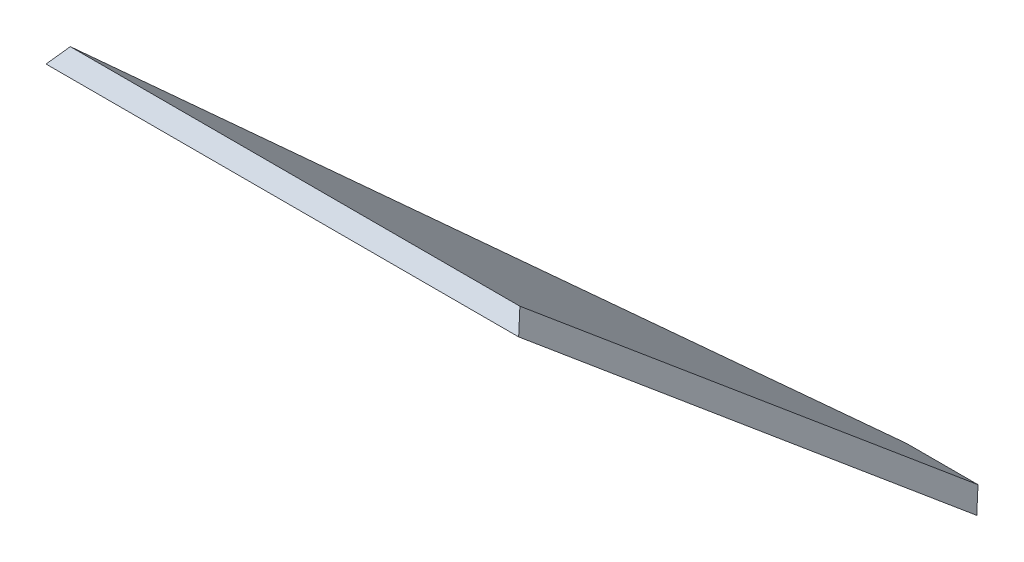
ISO-10303-21;
HEADER;
FILE_DESCRIPTION(('STEP AP214'),'2;1');
FILE_NAME('part.step','',(''),(''),'','','');
FILE_SCHEMA(('AUTOMOTIVE_DESIGN { 1 0 10303 214 1 1 1 1 }'));
ENDSEC;
DATA;
#1=APPLICATION_CONTEXT('core data for automotive mechanical design processes');
#2=APPLICATION_PROTOCOL_DEFINITION('international standard','automotive_design',2000,#1);
#3=PRODUCT_CONTEXT('',#1,'mechanical');
#4=PRODUCT('Part','Part','',(#3));
#5=PRODUCT_RELATED_PRODUCT_CATEGORY('part','',(#4));
#6=PRODUCT_DEFINITION_FORMATION('','',#4);
#7=PRODUCT_DEFINITION_CONTEXT('part definition',#1,'design');
#8=PRODUCT_DEFINITION('design','',#6,#7);
#9=PRODUCT_DEFINITION_SHAPE('','',#8);
#10=(LENGTH_UNIT() NAMED_UNIT(*) SI_UNIT(.MILLI.,.METRE.));
#11=(NAMED_UNIT(*) PLANE_ANGLE_UNIT() SI_UNIT($,.RADIAN.));
#12=(NAMED_UNIT(*) SI_UNIT($,.STERADIAN.) SOLID_ANGLE_UNIT());
#13=UNCERTAINTY_MEASURE_WITH_UNIT(LENGTH_MEASURE(1.E-05),#10,'distance_accuracy_value','');
#14=(GEOMETRIC_REPRESENTATION_CONTEXT(3) GLOBAL_UNCERTAINTY_ASSIGNED_CONTEXT((#13)) GLOBAL_UNIT_ASSIGNED_CONTEXT((#10,
#11,#12)) REPRESENTATION_CONTEXT('',''));
#15=CARTESIAN_POINT('',(0.,0.,0.));
#16=DIRECTION('',(0.,0.,1.));
#17=DIRECTION('',(1.,0.,0.));
#18=AXIS2_PLACEMENT_3D('',#15,#16,#17);
#19=CARTESIAN_POINT('',(159.440890218229,313.348268491755,89.3256315210229));
#20=DIRECTION('',(-0.843459103537497,0.255501074852022,-0.472541999624567));
#21=DIRECTION('',(-0.488764700454788,0.,0.872415650701741));
#22=AXIS2_PLACEMENT_3D('',#19,#20,#21);
#23=PLANE('',#22);
#24=DIRECTION('',(-0.513309975276949,-0.642705823376138,0.568719697108847));
#25=VECTOR('',#24,1.);
#26=CARTESIAN_POINT('',(-10.582845755189,20.5425692053769,234.489229864168));
#27=LINE('',#26,#25);
#28=CARTESIAN_POINT('',(-1.87445158451926,31.4461867373068,224.84079999998));
#29=VERTEX_POINT('',#28);
#30=CARTESIAN_POINT('',(4.77217542707278,39.7683041554508,217.476696664975));
#31=VERTEX_POINT('',#30);
#32=EDGE_CURVE('E82',#29,#31,#27,.F.);
#33=ORIENTED_EDGE('',*,*,#32,.F.);
#34=DIRECTION('',(-0.213764834318811,0.647368565890785,0.731586314459996));
#35=VECTOR('',#34,1.);
#36=CARTESIAN_POINT('',(-12.3211297202073,63.0830603352195,260.59339129963));
#37=LINE('',#36,#35);
#38=CARTESIAN_POINT('',(-110.9083960964,361.646186737307,597.997319736598));
#39=VERTEX_POINT('',#38);
#40=EDGE_CURVE('E41',#29,#39,#37,.T.);
#41=ORIENTED_EDGE('',*,*,#40,.T.);
#42=DIRECTION('',(-0.513309975276949,-0.642705823376138,0.568719697108847));
#43=VECTOR('',#42,1.);
#44=CARTESIAN_POINT('',(-135.699548533921,330.605648257212,625.464576139786));
#45=LINE('',#44,#43);
#46=CARTESIAN_POINT('',(-104.261769084808,369.968304155451,590.633216401593));
#47=VERTEX_POINT('',#46);
#48=EDGE_CURVE('E83',#47,#39,#45,.T.);
#49=ORIENTED_EDGE('',*,*,#48,.F.);
#50=DIRECTION('',(-0.213764834318811,0.647368565890785,0.731586314459996));
#51=VECTOR('',#50,1.);
#52=CARTESIAN_POINT('',(-5.97822301774842,72.3249688012315,254.268736863194));
#53=LINE('',#52,#51);
#54=EDGE_CURVE('E79',#31,#47,#53,.T.);
#55=ORIENTED_EDGE('',*,*,#54,.F.);
#56=EDGE_LOOP('',(#33,#41,#49,#55));
#57=FACE_BOUND('',#56,.T.);
#58=ADVANCED_FACE('F38',(#57),#23,.T.);
#59=CARTESIAN_POINT('',(-123.381202334399,324.271488093634,69.1234463208217));
#60=DIRECTION('',(0.843459103537485,0.255501074852039,-0.472541999624579));
#61=DIRECTION('',(-0.488764700454802,0.,-0.872415650701733));
#62=AXIS2_PLACEMENT_3D('',#59,#60,#61);
#63=PLANE('',#62);
#64=DIRECTION('',(-0.51330997527697,0.642705823376129,-0.568719697108839));
#65=VECTOR('',#64,1.);
#66=CARTESIAN_POINT('',(65.0027706220085,482.587615000697,490.978260708074));
#67=LINE('',#66,#65);
#68=CARTESIAN_POINT('',(161.595082833736,361.646186737307,597.997319736598));
#69=VERTEX_POINT('',#68);
#70=CARTESIAN_POINT('',(154.948455822144,369.968304155451,590.633216401593));
#71=VERTEX_POINT('',#70);
#72=EDGE_CURVE('E97',#69,#71,#67,.T.);
#73=ORIENTED_EDGE('',*,*,#72,.F.);
#74=DIRECTION('',(-0.213764834318812,-0.647368565890785,-0.731586314459996));
#75=VECTOR('',#74,1.);
#76=CARTESIAN_POINT('',(60.6916678098232,56.0688017306996,252.666630762394));
#77=LINE('',#76,#75);
#78=CARTESIAN_POINT('',(52.5611383218553,31.4461867373069,224.84079999998));
#79=VERTEX_POINT('',#78);
#80=EDGE_CURVE('E11',#69,#79,#77,.T.);
#81=ORIENTED_EDGE('',*,*,#80,.T.);
#82=DIRECTION('',(-0.51330997527697,0.642705823376129,-0.568719697108839));
#83=VECTOR('',#82,1.);
#84=CARTESIAN_POINT('',(29.5096667577666,60.3085033202547,199.301015937206));
#85=LINE('',#84,#83);
#86=CARTESIAN_POINT('',(45.9145113102629,39.7683041554508,217.476696664976));
#87=VERTEX_POINT('',#86);
#88=EDGE_CURVE('E88',#87,#79,#85,.F.);
#89=ORIENTED_EDGE('',*,*,#88,.F.);
#90=DIRECTION('',(-0.213764834318812,-0.647368565890785,-0.731586314459996));
#91=VECTOR('',#90,1.);
#92=CARTESIAN_POINT('',(54.3487611073639,65.3107101967116,246.341976325958));
#93=LINE('',#92,#91);
#94=EDGE_CURVE('E89',#71,#87,#93,.T.);
#95=ORIENTED_EDGE('',*,*,#94,.F.);
#96=EDGE_LOOP('',(#73,#81,#89,#95));
#97=FACE_BOUND('',#96,.T.);
#98=ADVANCED_FACE('F119',(#97),#63,.T.);
#99=CARTESIAN_POINT('',(-204.997061337424,361.646186737307,597.997319736598));
#100=DIRECTION('',(0.,0.662686464342369,0.748896955513514));
#101=DIRECTION('',(1.,0.,0.));
#102=AXIS2_PLACEMENT_3D('',#99,#100,#101);
#103=PLANE('',#102);
#104=DIRECTION('',(1.,0.,0.));
#105=VECTOR('',#104,1.);
#106=CARTESIAN_POINT('',(0.,369.968304155451,590.633216401593));
#107=LINE('',#106,#105);
#108=EDGE_CURVE('E101',#47,#71,#107,.T.);
#109=ORIENTED_EDGE('',*,*,#108,.F.);
#110=ORIENTED_EDGE('',*,*,#48,.T.);
#111=DIRECTION('',(1.,0.,0.));
#112=VECTOR('',#111,1.);
#113=CARTESIAN_POINT('',(-204.997061337424,361.646186737307,597.997319736598));
#114=LINE('',#113,#112);
#115=EDGE_CURVE('E53',#39,#69,#114,.T.);
#116=ORIENTED_EDGE('',*,*,#115,.T.);
#117=ORIENTED_EDGE('',*,*,#72,.T.);
#118=EDGE_LOOP('',(#109,#110,#116,#117));
#119=FACE_BOUND('',#118,.T.);
#120=ADVANCED_FACE('F120',(#119),#103,.T.);
#121=CARTESIAN_POINT('',(-34.9249999999667,31.4461867373069,224.84079999998));
#122=DIRECTION('',(0.,0.662686464342369,0.748896955513514));
#123=DIRECTION('',(1.,0.,0.));
#124=AXIS2_PLACEMENT_3D('',#121,#122,#123);
#125=PLANE('',#124);
#126=DIRECTION('',(1.,0.,0.));
#127=VECTOR('',#126,1.);
#128=CARTESIAN_POINT('',(-34.9249999999667,31.4461867373069,224.84079999998));
#129=LINE('',#128,#127);
#130=EDGE_CURVE('E96',#29,#79,#129,.T.);
#131=ORIENTED_EDGE('',*,*,#130,.F.);
#132=ORIENTED_EDGE('',*,*,#32,.T.);
#133=DIRECTION('',(1.,0.,0.));
#134=VECTOR('',#133,1.);
#135=CARTESIAN_POINT('',(0.,39.7683041554508,217.476696664976));
#136=LINE('',#135,#134);
#137=EDGE_CURVE('E95',#31,#87,#136,.T.);
#138=ORIENTED_EDGE('',*,*,#137,.T.);
#139=ORIENTED_EDGE('',*,*,#88,.T.);
#140=EDGE_LOOP('',(#131,#132,#138,#139));
#141=FACE_BOUND('',#140,.T.);
#142=ADVANCED_FACE('F93',(#141),#125,.F.);
#143=CARTESIAN_POINT('',(0.,73.1918767145628,255.248422931852));
#144=DIRECTION('',(0.,0.748896955513514,-0.662686464342369));
#145=DIRECTION('',(0.,0.662686464342369,0.748896955513514));
#146=AXIS2_PLACEMENT_3D('',#143,#144,#145);
#147=PLANE('',#146);
#148=ORIENTED_EDGE('',*,*,#137,.F.);
#149=ORIENTED_EDGE('',*,*,#54,.T.);
#150=ORIENTED_EDGE('',*,*,#108,.T.);
#151=ORIENTED_EDGE('',*,*,#94,.T.);
#152=EDGE_LOOP('',(#148,#149,#150,#151));
#153=FACE_BOUND('',#152,.T.);
#154=ADVANCED_FACE('F99',(#153),#147,.T.);
#155=CARTESIAN_POINT('',(0.,64.8697592964189,262.612526266856));
#156=DIRECTION('',(0.,0.748896955513514,-0.662686464342369));
#157=DIRECTION('',(0.,0.662686464342369,0.748896955513514));
#158=AXIS2_PLACEMENT_3D('',#155,#156,#157);
#159=PLANE('',#158);
#160=ORIENTED_EDGE('',*,*,#40,.F.);
#161=ORIENTED_EDGE('',*,*,#130,.T.);
#162=ORIENTED_EDGE('',*,*,#80,.F.);
#163=ORIENTED_EDGE('',*,*,#115,.F.);
#164=EDGE_LOOP('',(#160,#161,#162,#163));
#165=FACE_BOUND('',#164,.T.);
#166=ADVANCED_FACE('F117',(#165),#159,.F.);
#167=CLOSED_SHELL('',(#58,#98,#120,#142,#154,#166));
#168=MANIFOLD_SOLID_BREP('B2',#167);
#169=ADVANCED_BREP_SHAPE_REPRESENTATION('',(#18,#168),#14);
#170=SHAPE_DEFINITION_REPRESENTATION(#9,#169);
ENDSEC;
END-ISO-10303-21;
